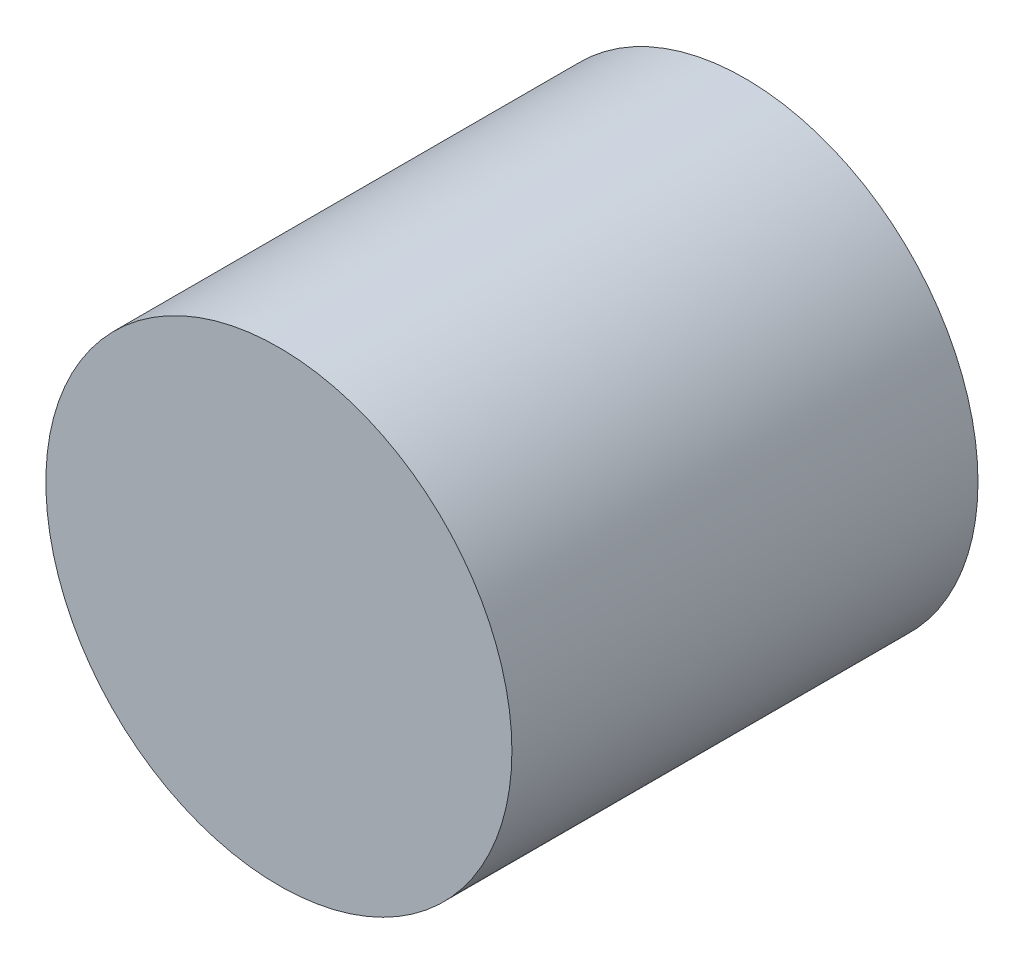
ISO-10303-21;
HEADER;
FILE_DESCRIPTION(('STEP AP214'),'2;1');
FILE_NAME('part.step','',(''),(''),'','','');
FILE_SCHEMA(('AUTOMOTIVE_DESIGN { 1 0 10303 214 1 1 1 1 }'));
ENDSEC;
DATA;
#1=APPLICATION_CONTEXT('core data for automotive mechanical design processes');
#2=APPLICATION_PROTOCOL_DEFINITION('international standard','automotive_design',2000,#1);
#3=PRODUCT_CONTEXT('',#1,'mechanical');
#4=PRODUCT('Part','Part','',(#3));
#5=PRODUCT_RELATED_PRODUCT_CATEGORY('part','',(#4));
#6=PRODUCT_DEFINITION_FORMATION('','',#4);
#7=PRODUCT_DEFINITION_CONTEXT('part definition',#1,'design');
#8=PRODUCT_DEFINITION('design','',#6,#7);
#9=PRODUCT_DEFINITION_SHAPE('','',#8);
#10=(LENGTH_UNIT() NAMED_UNIT(*) SI_UNIT(.MILLI.,.METRE.));
#11=(NAMED_UNIT(*) PLANE_ANGLE_UNIT() SI_UNIT($,.RADIAN.));
#12=(NAMED_UNIT(*) SI_UNIT($,.STERADIAN.) SOLID_ANGLE_UNIT());
#13=UNCERTAINTY_MEASURE_WITH_UNIT(LENGTH_MEASURE(1.E-05),#10,'distance_accuracy_value','');
#14=(GEOMETRIC_REPRESENTATION_CONTEXT(3) GLOBAL_UNCERTAINTY_ASSIGNED_CONTEXT((#13)) GLOBAL_UNIT_ASSIGNED_CONTEXT((#10,
#11,#12)) REPRESENTATION_CONTEXT('',''));
#15=CARTESIAN_POINT('',(0.,0.,0.));
#16=DIRECTION('',(0.,0.,1.));
#17=DIRECTION('',(1.,0.,0.));
#18=AXIS2_PLACEMENT_3D('',#15,#16,#17);
#19=CARTESIAN_POINT('',(0.,0.,6.3));
#20=DIRECTION('',(0.,0.,-1.));
#21=DIRECTION('',(-1.,0.,0.));
#22=AXIS2_PLACEMENT_3D('',#19,#20,#21);
#23=CYLINDRICAL_SURFACE('',#22,3.15);
#24=CARTESIAN_POINT('',(0.,0.,6.3));
#25=DIRECTION('',(0.,0.,1.));
#26=DIRECTION('',(1.,0.,0.));
#27=AXIS2_PLACEMENT_3D('',#24,#25,#26);
#28=CIRCLE('',#27,3.15);
#29=CARTESIAN_POINT('',(3.15,0.,6.3));
#30=VERTEX_POINT('',#29);
#31=EDGE_CURVE('E10',#30,#30,#28,.T.);
#32=ORIENTED_EDGE('',*,*,#31,.F.);
#33=EDGE_LOOP('',(#32));
#34=FACE_BOUND('',#33,.T.);
#35=CARTESIAN_POINT('',(0.,0.,0.));
#36=DIRECTION('',(0.,0.,1.));
#37=DIRECTION('',(1.,0.,0.));
#38=AXIS2_PLACEMENT_3D('',#35,#36,#37);
#39=CIRCLE('',#38,3.15);
#40=CARTESIAN_POINT('',(3.15,0.,0.));
#41=VERTEX_POINT('',#40);
#42=EDGE_CURVE('E42',#41,#41,#39,.T.);
#43=ORIENTED_EDGE('',*,*,#42,.T.);
#44=EDGE_LOOP('',(#43));
#45=FACE_BOUND('',#44,.T.);
#46=ADVANCED_FACE('F39',(#34,#45),#23,.T.);
#47=CARTESIAN_POINT('',(0.,0.,6.3));
#48=DIRECTION('',(0.,0.,1.));
#49=DIRECTION('',(1.,0.,0.));
#50=AXIS2_PLACEMENT_3D('',#47,#48,#49);
#51=PLANE('',#50);
#52=ORIENTED_EDGE('',*,*,#31,.T.);
#53=EDGE_LOOP('',(#52));
#54=FACE_BOUND('',#53,.T.);
#55=ADVANCED_FACE('F56',(#54),#51,.T.);
#56=CARTESIAN_POINT('',(0.,0.,0.));
#57=DIRECTION('',(0.,0.,1.));
#58=DIRECTION('',(1.,0.,0.));
#59=AXIS2_PLACEMENT_3D('',#56,#57,#58);
#60=PLANE('',#59);
#61=ORIENTED_EDGE('',*,*,#42,.F.);
#62=EDGE_LOOP('',(#61));
#63=FACE_BOUND('',#62,.T.);
#64=ADVANCED_FACE('F54',(#63),#60,.F.);
#65=CLOSED_SHELL('',(#46,#55,#64));
#66=MANIFOLD_SOLID_BREP('B2',#65);
#67=ADVANCED_BREP_SHAPE_REPRESENTATION('',(#18,#66),#14);
#68=SHAPE_DEFINITION_REPRESENTATION(#9,#67);
ENDSEC;
END-ISO-10303-21;
